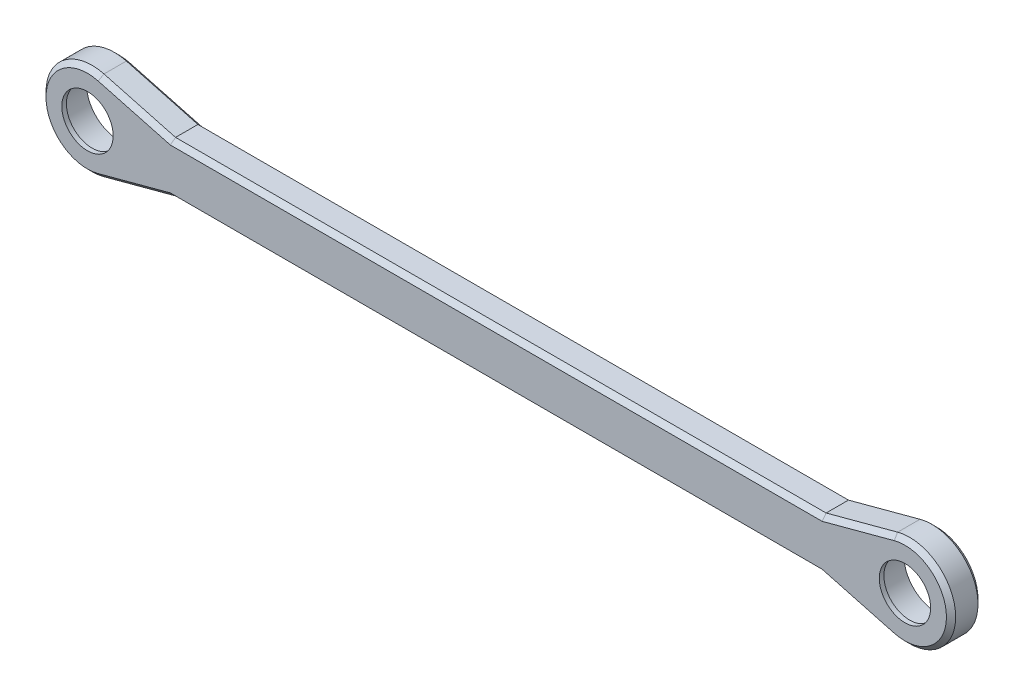
ISO-10303-21;
HEADER;
FILE_DESCRIPTION(('STEP AP214'),'2;1');
FILE_NAME('part.step','',(''),(''),'','','');
FILE_SCHEMA(('AUTOMOTIVE_DESIGN { 1 0 10303 214 1 1 1 1 }'));
ENDSEC;
DATA;
#1=APPLICATION_CONTEXT('core data for automotive mechanical design processes');
#2=APPLICATION_PROTOCOL_DEFINITION('international standard','automotive_design',2000,#1);
#3=PRODUCT_CONTEXT('',#1,'mechanical');
#4=PRODUCT('Part','Part','',(#3));
#5=PRODUCT_RELATED_PRODUCT_CATEGORY('part','',(#4));
#6=PRODUCT_DEFINITION_FORMATION('','',#4);
#7=PRODUCT_DEFINITION_CONTEXT('part definition',#1,'design');
#8=PRODUCT_DEFINITION('design','',#6,#7);
#9=PRODUCT_DEFINITION_SHAPE('','',#8);
#10=(LENGTH_UNIT() NAMED_UNIT(*) SI_UNIT(.MILLI.,.METRE.));
#11=(NAMED_UNIT(*) PLANE_ANGLE_UNIT() SI_UNIT($,.RADIAN.));
#12=(NAMED_UNIT(*) SI_UNIT($,.STERADIAN.) SOLID_ANGLE_UNIT());
#13=UNCERTAINTY_MEASURE_WITH_UNIT(LENGTH_MEASURE(1.E-05),#10,'distance_accuracy_value','');
#14=(GEOMETRIC_REPRESENTATION_CONTEXT(3) GLOBAL_UNCERTAINTY_ASSIGNED_CONTEXT((#13)) GLOBAL_UNIT_ASSIGNED_CONTEXT((#10,
#11,#12)) REPRESENTATION_CONTEXT('',''));
#15=CARTESIAN_POINT('',(0.,0.,0.));
#16=DIRECTION('',(0.,0.,1.));
#17=DIRECTION('',(1.,0.,0.));
#18=AXIS2_PLACEMENT_3D('',#15,#16,#17);
#19=CARTESIAN_POINT('',(177.4,0.,6.85));
#20=DIRECTION('',(0.,0.,-1.));
#21=DIRECTION('',(-1.,0.,0.));
#22=AXIS2_PLACEMENT_3D('',#19,#20,#21);
#23=CYLINDRICAL_SURFACE('',#22,7.075);
#24=CARTESIAN_POINT('',(177.4,0.,0.));
#25=DIRECTION('',(0.,0.,1.));
#26=DIRECTION('',(1.,0.,0.));
#27=AXIS2_PLACEMENT_3D('',#24,#25,#26);
#28=CIRCLE('',#27,7.075);
#29=CARTESIAN_POINT('',(170.325,0.,0.));
#30=VERTEX_POINT('',#29);
#31=EDGE_CURVE('E371',#30,#30,#28,.T.);
#32=CARTESIAN_POINT('',(177.4,0.,5.85));
#33=DIRECTION('',(0.,0.,1.));
#34=DIRECTION('',(1.,0.,0.));
#35=AXIS2_PLACEMENT_3D('',#32,#33,#34);
#36=CIRCLE('',#35,7.075);
#37=CARTESIAN_POINT('',(170.325,0.,5.85));
#38=VERTEX_POINT('',#37);
#39=EDGE_CURVE('E217',#38,#38,#36,.T.);
#40=CARTESIAN_POINT('',(170.325,0.,0.));
#41=CARTESIAN_POINT('',(170.325,0.,0.0609374999999999));
#42=CARTESIAN_POINT('',(170.325,0.,0.121875));
#43=CARTESIAN_POINT('',(170.325,0.,0.24375));
#44=CARTESIAN_POINT('',(170.325,0.,0.3046875));
#45=CARTESIAN_POINT('',(170.325,0.,0.4265625));
#46=CARTESIAN_POINT('',(170.325,0.,0.4875));
#47=CARTESIAN_POINT('',(170.325,0.,0.609375));
#48=CARTESIAN_POINT('',(170.325,0.,0.6703125));
#49=CARTESIAN_POINT('',(170.325,0.,0.7921875));
#50=CARTESIAN_POINT('',(170.325,0.,0.853125));
#51=CARTESIAN_POINT('',(170.325,0.,0.975));
#52=CARTESIAN_POINT('',(170.325,0.,1.0359375));
#53=CARTESIAN_POINT('',(170.325,0.,1.1578125));
#54=CARTESIAN_POINT('',(170.325,0.,1.21875));
#55=CARTESIAN_POINT('',(170.325,0.,1.340625));
#56=CARTESIAN_POINT('',(170.325,0.,1.4015625));
#57=CARTESIAN_POINT('',(170.325,0.,1.5234375));
#58=CARTESIAN_POINT('',(170.325,0.,1.584375));
#59=CARTESIAN_POINT('',(170.325,0.,1.70625));
#60=CARTESIAN_POINT('',(170.325,0.,1.7671875));
#61=CARTESIAN_POINT('',(170.325,0.,1.8890625));
#62=CARTESIAN_POINT('',(170.325,0.,1.95));
#63=CARTESIAN_POINT('',(170.325,0.,2.071875));
#64=CARTESIAN_POINT('',(170.325,0.,2.1328125));
#65=CARTESIAN_POINT('',(170.325,0.,2.2546875));
#66=CARTESIAN_POINT('',(170.325,0.,2.315625));
#67=CARTESIAN_POINT('',(170.325,0.,2.4375));
#68=CARTESIAN_POINT('',(170.325,0.,2.4984375));
#69=CARTESIAN_POINT('',(170.325,0.,2.6203125));
#70=CARTESIAN_POINT('',(170.325,0.,2.68125));
#71=CARTESIAN_POINT('',(170.325,0.,2.803125));
#72=CARTESIAN_POINT('',(170.325,0.,2.8640625));
#73=CARTESIAN_POINT('',(170.325,0.,2.9859375));
#74=CARTESIAN_POINT('',(170.325,0.,3.046875));
#75=CARTESIAN_POINT('',(170.325,0.,3.16875));
#76=CARTESIAN_POINT('',(170.325,0.,3.2296875));
#77=CARTESIAN_POINT('',(170.325,0.,3.3515625));
#78=CARTESIAN_POINT('',(170.325,0.,3.4125));
#79=CARTESIAN_POINT('',(170.325,0.,3.534375));
#80=CARTESIAN_POINT('',(170.325,0.,3.5953125));
#81=CARTESIAN_POINT('',(170.325,0.,3.7171875));
#82=CARTESIAN_POINT('',(170.325,0.,3.778125));
#83=CARTESIAN_POINT('',(170.325,0.,3.9));
#84=CARTESIAN_POINT('',(170.325,0.,3.9609375));
#85=CARTESIAN_POINT('',(170.325,0.,4.0828125));
#86=CARTESIAN_POINT('',(170.325,0.,4.14375));
#87=CARTESIAN_POINT('',(170.325,0.,4.265625));
#88=CARTESIAN_POINT('',(170.325,0.,4.3265625));
#89=CARTESIAN_POINT('',(170.325,0.,4.4484375));
#90=CARTESIAN_POINT('',(170.325,0.,4.509375));
#91=CARTESIAN_POINT('',(170.325,0.,4.63125));
#92=CARTESIAN_POINT('',(170.325,0.,4.6921875));
#93=CARTESIAN_POINT('',(170.325,0.,4.8140625));
#94=CARTESIAN_POINT('',(170.325,0.,4.875));
#95=CARTESIAN_POINT('',(170.325,0.,4.996875));
#96=CARTESIAN_POINT('',(170.325,0.,5.0578125));
#97=CARTESIAN_POINT('',(170.325,0.,5.1796875));
#98=CARTESIAN_POINT('',(170.325,0.,5.240625));
#99=CARTESIAN_POINT('',(170.325,0.,5.3625));
#100=CARTESIAN_POINT('',(170.325,0.,5.4234375));
#101=CARTESIAN_POINT('',(170.325,0.,5.5453125));
#102=CARTESIAN_POINT('',(170.325,0.,5.60625));
#103=CARTESIAN_POINT('',(170.325,0.,5.728125));
#104=CARTESIAN_POINT('',(170.325,0.,5.7890625));
#105=CARTESIAN_POINT('',(170.325,0.,5.85));
#106=B_SPLINE_CURVE_WITH_KNOTS('',3,(#40,#41,#42,#43,#44,#45,#46,#47,#48,#49,#50,#51,#52,#53,
#54,#55,#56,#57,#58,#59,#60,#61,#62,#63,#64,#65,#66,#67,#68,#69,#70,#71,#72,#73,#74,#75,#76,#77,
#78,#79,#80,#81,#82,#83,#84,#85,#86,#87,#88,#89,#90,#91,#92,#93,#94,#95,#96,#97,#98,#99,#100,
#101,#102,#103,#104,#105),.UNSPECIFIED.,.F.,.F.,(4,2,2,2,2,2,2,2,2,2,2,2,2,2,2,2,2,2,2,2,2,2,2,
2,2,2,2,2,2,2,2,2,4),(0.,0.1828125,0.365625,0.5484375,0.73125,0.9140625,1.096875,1.2796875,
1.4625,1.6453125,1.828125,2.0109375,2.19375,2.3765625,2.559375,2.7421875,2.925,3.1078125,
3.290625,3.4734375,3.65625,3.8390625,4.021875,4.2046875,4.3875,4.5703125,4.753125,4.9359375,
5.11875,5.3015625,5.484375,5.6671875,5.85),.UNSPECIFIED.);
#107=EDGE_CURVE('BSEAM48',#30,#38,#106,.T.);
#108=ORIENTED_EDGE('',*,*,#31,.F.);
#109=ORIENTED_EDGE('',*,*,#39,.T.);
#110=ORIENTED_EDGE('',*,*,#107,.T.);
#111=ORIENTED_EDGE('',*,*,#107,.F.);
#112=EDGE_LOOP('',(#108,#110,#109,#111));
#113=FACE_BOUND('',#112,.T.);
#114=ADVANCED_FACE('F48',(#113),#23,.F.);
#115=CARTESIAN_POINT('',(0.,0.,6.85));
#116=DIRECTION('',(0.,0.,-1.));
#117=DIRECTION('',(-1.,0.,0.));
#118=AXIS2_PLACEMENT_3D('',#115,#116,#117);
#119=CYLINDRICAL_SURFACE('',#118,7.075);
#120=CARTESIAN_POINT('',(0.,0.,0.));
#121=DIRECTION('',(0.,0.,1.));
#122=DIRECTION('',(1.,0.,0.));
#123=AXIS2_PLACEMENT_3D('',#120,#121,#122);
#124=CIRCLE('',#123,7.075);
#125=CARTESIAN_POINT('',(-7.075,0.,0.));
#126=VERTEX_POINT('',#125);
#127=EDGE_CURVE('E375',#126,#126,#124,.T.);
#128=CARTESIAN_POINT('',(0.,0.,5.85));
#129=DIRECTION('',(0.,0.,1.));
#130=DIRECTION('',(1.,0.,0.));
#131=AXIS2_PLACEMENT_3D('',#128,#129,#130);
#132=CIRCLE('',#131,7.075);
#133=CARTESIAN_POINT('',(-7.075,0.,5.85));
#134=VERTEX_POINT('',#133);
#135=EDGE_CURVE('E379',#134,#134,#132,.T.);
#136=CARTESIAN_POINT('',(-7.075,0.,0.));
#137=CARTESIAN_POINT('',(-7.075,0.,0.0609374999999999));
#138=CARTESIAN_POINT('',(-7.075,0.,0.121875));
#139=CARTESIAN_POINT('',(-7.075,0.,0.24375));
#140=CARTESIAN_POINT('',(-7.075,0.,0.3046875));
#141=CARTESIAN_POINT('',(-7.075,0.,0.4265625));
#142=CARTESIAN_POINT('',(-7.075,0.,0.4875));
#143=CARTESIAN_POINT('',(-7.075,0.,0.609375));
#144=CARTESIAN_POINT('',(-7.075,0.,0.6703125));
#145=CARTESIAN_POINT('',(-7.075,0.,0.7921875));
#146=CARTESIAN_POINT('',(-7.075,0.,0.853125));
#147=CARTESIAN_POINT('',(-7.075,0.,0.975));
#148=CARTESIAN_POINT('',(-7.075,0.,1.0359375));
#149=CARTESIAN_POINT('',(-7.075,0.,1.1578125));
#150=CARTESIAN_POINT('',(-7.075,0.,1.21875));
#151=CARTESIAN_POINT('',(-7.075,0.,1.340625));
#152=CARTESIAN_POINT('',(-7.075,0.,1.4015625));
#153=CARTESIAN_POINT('',(-7.075,0.,1.5234375));
#154=CARTESIAN_POINT('',(-7.075,0.,1.584375));
#155=CARTESIAN_POINT('',(-7.075,0.,1.70625));
#156=CARTESIAN_POINT('',(-7.075,0.,1.7671875));
#157=CARTESIAN_POINT('',(-7.075,0.,1.8890625));
#158=CARTESIAN_POINT('',(-7.075,0.,1.95));
#159=CARTESIAN_POINT('',(-7.075,0.,2.071875));
#160=CARTESIAN_POINT('',(-7.075,0.,2.1328125));
#161=CARTESIAN_POINT('',(-7.075,0.,2.2546875));
#162=CARTESIAN_POINT('',(-7.075,0.,2.315625));
#163=CARTESIAN_POINT('',(-7.075,0.,2.4375));
#164=CARTESIAN_POINT('',(-7.075,0.,2.4984375));
#165=CARTESIAN_POINT('',(-7.075,0.,2.6203125));
#166=CARTESIAN_POINT('',(-7.075,0.,2.68125));
#167=CARTESIAN_POINT('',(-7.075,0.,2.803125));
#168=CARTESIAN_POINT('',(-7.075,0.,2.8640625));
#169=CARTESIAN_POINT('',(-7.075,0.,2.9859375));
#170=CARTESIAN_POINT('',(-7.075,0.,3.046875));
#171=CARTESIAN_POINT('',(-7.075,0.,3.16875));
#172=CARTESIAN_POINT('',(-7.075,0.,3.2296875));
#173=CARTESIAN_POINT('',(-7.075,0.,3.3515625));
#174=CARTESIAN_POINT('',(-7.075,0.,3.4125));
#175=CARTESIAN_POINT('',(-7.075,0.,3.534375));
#176=CARTESIAN_POINT('',(-7.075,0.,3.5953125));
#177=CARTESIAN_POINT('',(-7.075,0.,3.7171875));
#178=CARTESIAN_POINT('',(-7.075,0.,3.778125));
#179=CARTESIAN_POINT('',(-7.075,0.,3.9));
#180=CARTESIAN_POINT('',(-7.075,0.,3.9609375));
#181=CARTESIAN_POINT('',(-7.075,0.,4.0828125));
#182=CARTESIAN_POINT('',(-7.075,0.,4.14375));
#183=CARTESIAN_POINT('',(-7.075,0.,4.265625));
#184=CARTESIAN_POINT('',(-7.075,0.,4.3265625));
#185=CARTESIAN_POINT('',(-7.075,0.,4.4484375));
#186=CARTESIAN_POINT('',(-7.075,0.,4.509375));
#187=CARTESIAN_POINT('',(-7.075,0.,4.63125));
#188=CARTESIAN_POINT('',(-7.075,0.,4.6921875));
#189=CARTESIAN_POINT('',(-7.075,0.,4.8140625));
#190=CARTESIAN_POINT('',(-7.075,0.,4.875));
#191=CARTESIAN_POINT('',(-7.075,0.,4.996875));
#192=CARTESIAN_POINT('',(-7.075,0.,5.0578125));
#193=CARTESIAN_POINT('',(-7.075,0.,5.1796875));
#194=CARTESIAN_POINT('',(-7.075,0.,5.240625));
#195=CARTESIAN_POINT('',(-7.075,0.,5.3625));
#196=CARTESIAN_POINT('',(-7.075,0.,5.4234375));
#197=CARTESIAN_POINT('',(-7.075,0.,5.5453125));
#198=CARTESIAN_POINT('',(-7.075,0.,5.60625));
#199=CARTESIAN_POINT('',(-7.075,0.,5.728125));
#200=CARTESIAN_POINT('',(-7.075,0.,5.7890625));
#201=CARTESIAN_POINT('',(-7.075,0.,5.85));
#202=B_SPLINE_CURVE_WITH_KNOTS('',3,(#136,#137,#138,#139,#140,#141,#142,#143,#144,#145,#146,
#147,#148,#149,#150,#151,#152,#153,#154,#155,#156,#157,#158,#159,#160,#161,#162,#163,#164,#165,
#166,#167,#168,#169,#170,#171,#172,#173,#174,#175,#176,#177,#178,#179,#180,#181,#182,#183,#184,
#185,#186,#187,#188,#189,#190,#191,#192,#193,#194,#195,#196,#197,#198,#199,#200,#201),
.UNSPECIFIED.,.F.,.F.,(4,2,2,2,2,2,2,2,2,2,2,2,2,2,2,2,2,2,2,2,2,2,2,2,2,2,2,2,2,2,2,2,4),(0.,
0.1828125,0.365625,0.5484375,0.73125,0.9140625,1.096875,1.2796875,1.4625,1.6453125,1.828125,
2.0109375,2.19375,2.3765625,2.559375,2.7421875,2.925,3.1078125,3.290625,3.4734375,3.65625,
3.8390625,4.021875,4.2046875,4.3875,4.5703125,4.753125,4.9359375,5.11875,5.3015625,5.484375,
5.6671875,5.85),.UNSPECIFIED.);
#203=EDGE_CURVE('BSEAM421',#126,#134,#202,.T.);
#204=ORIENTED_EDGE('',*,*,#127,.F.);
#205=ORIENTED_EDGE('',*,*,#135,.T.);
#206=ORIENTED_EDGE('',*,*,#203,.T.);
#207=ORIENTED_EDGE('',*,*,#203,.F.);
#208=EDGE_LOOP('',(#204,#206,#205,#207));
#209=FACE_BOUND('',#208,.T.);
#210=ADVANCED_FACE('F421',(#209),#119,.F.);
#211=CARTESIAN_POINT('',(9.29535623329457,34.6907417371083,6.85));
#212=DIRECTION('',(-0.258819045102515,-0.96592582628907,0.));
#213=DIRECTION('',(0.96592582628907,-0.258819045102515,0.));
#214=AXIS2_PLACEMENT_3D('',#211,#212,#213);
#215=PLANE('',#214);
#216=DIRECTION('',(0.,0.,-1.));
#217=VECTOR('',#216,1.);
#218=CARTESIAN_POINT('',(159.289246390066,-5.5,6.85));
#219=LINE('',#218,#217);
#220=CARTESIAN_POINT('',(159.289246390066,-5.5,5.84999999999997));
#221=VERTEX_POINT('',#220);
#222=CARTESIAN_POINT('',(159.289246390066,-5.5,0.999999999999975));
#223=VERTEX_POINT('',#222);
#224=EDGE_CURVE('E367',#221,#223,#219,.T.);
#225=ORIENTED_EDGE('',*,*,#224,.T.);
#226=DIRECTION('',(0.96592582628907,-0.258819045102515,0.));
#227=VECTOR('',#226,1.);
#228=CARTESIAN_POINT('',(174.811809548975,-9.6592582628907,1.00000000000007));
#229=LINE('',#228,#227);
#230=CARTESIAN_POINT('',(174.811809548975,-9.65925826289071,1.00000000000008));
#231=VERTEX_POINT('',#230);
#232=EDGE_CURVE('E317',#223,#231,#229,.T.);
#233=ORIENTED_EDGE('',*,*,#232,.T.);
#234=DIRECTION('',(0.,0.,-1.));
#235=VECTOR('',#234,1.);
#236=CARTESIAN_POINT('',(174.811809548975,-9.65925826289071,6.85));
#237=LINE('',#236,#235);
#238=CARTESIAN_POINT('',(174.811809548975,-9.65925826289071,5.84999999999997));
#239=VERTEX_POINT('',#238);
#240=EDGE_CURVE('E187',#239,#231,#237,.T.);
#241=ORIENTED_EDGE('',*,*,#240,.F.);
#242=DIRECTION('',(-0.96592582628907,0.258819045102515,0.));
#243=VECTOR('',#242,1.);
#244=CARTESIAN_POINT('',(9.29535623329457,34.6907417371083,5.84999999999997));
#245=LINE('',#244,#243);
#246=EDGE_CURVE('E321',#239,#221,#245,.T.);
#247=ORIENTED_EDGE('',*,*,#246,.T.);
#248=EDGE_LOOP('',(#225,#233,#241,#247));
#249=FACE_BOUND('',#248,.T.);
#250=ADVANCED_FACE('F427',(#249),#215,.T.);
#251=CARTESIAN_POINT('',(177.4,0.,6.85));
#252=DIRECTION('',(0.,0.,-1.));
#253=DIRECTION('',(-1.,0.,0.));
#254=AXIS2_PLACEMENT_3D('',#251,#252,#253);
#255=CYLINDRICAL_SURFACE('',#254,10.);
#256=ORIENTED_EDGE('',*,*,#240,.T.);
#257=CARTESIAN_POINT('',(177.4,0.,1.00000000000008));
#258=DIRECTION('',(0.,0.,1.));
#259=DIRECTION('',(1.,0.,0.));
#260=AXIS2_PLACEMENT_3D('',#257,#258,#259);
#261=CIRCLE('',#260,10.);
#262=CARTESIAN_POINT('',(174.811809548975,9.65925826289071,1.00000000000008));
#263=VERTEX_POINT('',#262);
#264=EDGE_CURVE('E305',#231,#263,#261,.T.);
#265=ORIENTED_EDGE('',*,*,#264,.T.);
#266=DIRECTION('',(0.,0.,-1.));
#267=VECTOR('',#266,1.);
#268=CARTESIAN_POINT('',(174.811809548975,9.65925826289071,6.85));
#269=LINE('',#268,#267);
#270=CARTESIAN_POINT('',(174.811809548975,9.65925826289071,5.84999999999997));
#271=VERTEX_POINT('',#270);
#272=EDGE_CURVE('E343',#271,#263,#269,.T.);
#273=ORIENTED_EDGE('',*,*,#272,.F.);
#274=CARTESIAN_POINT('',(177.4,0.,5.84999999999997));
#275=DIRECTION('',(0.,0.,1.));
#276=DIRECTION('',(1.,0.,0.));
#277=AXIS2_PLACEMENT_3D('',#274,#275,#276);
#278=CIRCLE('',#277,10.);
#279=EDGE_CURVE('E308',#271,#239,#278,.F.);
#280=ORIENTED_EDGE('',*,*,#279,.T.);
#281=EDGE_LOOP('',(#256,#265,#273,#280));
#282=FACE_BOUND('',#281,.T.);
#283=ADVANCED_FACE('F458',(#282),#255,.T.);
#284=CARTESIAN_POINT('',(9.29535623329461,-34.6907417371084,6.85));
#285=DIRECTION('',(0.258819045102515,-0.96592582628907,0.));
#286=DIRECTION('',(0.96592582628907,0.258819045102515,0.));
#287=AXIS2_PLACEMENT_3D('',#284,#285,#286);
#288=PLANE('',#287);
#289=ORIENTED_EDGE('',*,*,#272,.T.);
#290=DIRECTION('',(-0.96592582628907,-0.258819045102515,0.));
#291=VECTOR('',#290,1.);
#292=CARTESIAN_POINT('',(9.29535623329461,-34.6907417371084,1.00000000000008));
#293=LINE('',#292,#291);
#294=CARTESIAN_POINT('',(159.289246390066,5.5,1.00000000000003));
#295=VERTEX_POINT('',#294);
#296=EDGE_CURVE('E311',#263,#295,#293,.T.);
#297=ORIENTED_EDGE('',*,*,#296,.T.);
#298=DIRECTION('',(0.,0.,-1.));
#299=VECTOR('',#298,1.);
#300=CARTESIAN_POINT('',(159.289246390066,5.5,6.85));
#301=LINE('',#300,#299);
#302=CARTESIAN_POINT('',(159.289246390066,5.5,5.84999999999998));
#303=VERTEX_POINT('',#302);
#304=EDGE_CURVE('E347',#303,#295,#301,.T.);
#305=ORIENTED_EDGE('',*,*,#304,.F.);
#306=DIRECTION('',(0.96592582628907,0.258819045102515,0.));
#307=VECTOR('',#306,1.);
#308=CARTESIAN_POINT('',(174.811809548975,9.65925826289068,5.84999999999998));
#309=LINE('',#308,#307);
#310=EDGE_CURVE('E314',#303,#271,#309,.T.);
#311=ORIENTED_EDGE('',*,*,#310,.T.);
#312=EDGE_LOOP('',(#289,#297,#305,#311));
#313=FACE_BOUND('',#312,.T.);
#314=ADVANCED_FACE('F454',(#313),#288,.F.);
#315=CARTESIAN_POINT('',(0.,5.5,6.85));
#316=DIRECTION('',(0.,1.,0.));
#317=DIRECTION('',(0.,0.,1.));
#318=AXIS2_PLACEMENT_3D('',#315,#316,#317);
#319=PLANE('',#318);
#320=ORIENTED_EDGE('',*,*,#304,.T.);
#321=DIRECTION('',(-1.,0.,0.));
#322=VECTOR('',#321,1.);
#323=CARTESIAN_POINT('',(18.1107536099339,5.5,1.00000000000003));
#324=LINE('',#323,#322);
#325=CARTESIAN_POINT('',(18.1107536099339,5.5,0.999999999999975));
#326=VERTEX_POINT('',#325);
#327=EDGE_CURVE('E299',#295,#326,#324,.T.);
#328=ORIENTED_EDGE('',*,*,#327,.T.);
#329=DIRECTION('',(0.,0.,-1.));
#330=VECTOR('',#329,1.);
#331=CARTESIAN_POINT('',(18.1107536099339,5.5,6.85));
#332=LINE('',#331,#330);
#333=CARTESIAN_POINT('',(18.1107536099339,5.5,5.85));
#334=VERTEX_POINT('',#333);
#335=EDGE_CURVE('E351',#334,#326,#332,.T.);
#336=ORIENTED_EDGE('',*,*,#335,.F.);
#337=DIRECTION('',(1.,0.,0.));
#338=VECTOR('',#337,1.);
#339=CARTESIAN_POINT('',(0.,5.5,5.85));
#340=LINE('',#339,#338);
#341=EDGE_CURVE('E302',#334,#303,#340,.T.);
#342=ORIENTED_EDGE('',*,*,#341,.T.);
#343=EDGE_LOOP('',(#320,#328,#336,#342));
#344=FACE_BOUND('',#343,.T.);
#345=ADVANCED_FACE('F450',(#344),#319,.T.);
#346=CARTESIAN_POINT('',(2.58819045102521,9.65925826289068,6.85));
#347=DIRECTION('',(0.258819045102521,0.965925826289068,0.));
#348=DIRECTION('',(-0.965925826289068,0.258819045102521,0.));
#349=AXIS2_PLACEMENT_3D('',#346,#347,#348);
#350=PLANE('',#349);
#351=ORIENTED_EDGE('',*,*,#335,.T.);
#352=DIRECTION('',(-0.965925826289068,0.258819045102521,0.));
#353=VECTOR('',#352,1.);
#354=CARTESIAN_POINT('',(2.58819045102521,9.65925826289068,0.999999999999973));
#355=LINE('',#354,#353);
#356=CARTESIAN_POINT('',(2.58819045102521,9.65925826289068,0.999999999999975));
#357=VERTEX_POINT('',#356);
#358=EDGE_CURVE('E293',#326,#357,#355,.T.);
#359=ORIENTED_EDGE('',*,*,#358,.T.);
#360=DIRECTION('',(0.,0.,-1.));
#361=VECTOR('',#360,1.);
#362=CARTESIAN_POINT('',(2.58819045102521,9.65925826289068,6.85));
#363=LINE('',#362,#361);
#364=CARTESIAN_POINT('',(2.58819045102521,9.65925826289068,5.85));
#365=VERTEX_POINT('',#364);
#366=EDGE_CURVE('E355',#365,#357,#363,.T.);
#367=ORIENTED_EDGE('',*,*,#366,.F.);
#368=DIRECTION('',(0.965925826289068,-0.258819045102521,0.));
#369=VECTOR('',#368,1.);
#370=CARTESIAN_POINT('',(2.58819045102521,9.65925826289068,5.85));
#371=LINE('',#370,#369);
#372=EDGE_CURVE('E296',#365,#334,#371,.T.);
#373=ORIENTED_EDGE('',*,*,#372,.T.);
#374=EDGE_LOOP('',(#351,#359,#367,#373));
#375=FACE_BOUND('',#374,.T.);
#376=ADVANCED_FACE('F446',(#375),#350,.T.);
#377=CARTESIAN_POINT('',(0.,0.,6.85));
#378=DIRECTION('',(0.,0.,-1.));
#379=DIRECTION('',(-1.,0.,0.));
#380=AXIS2_PLACEMENT_3D('',#377,#378,#379);
#381=CYLINDRICAL_SURFACE('',#380,9.99999999999999);
#382=ORIENTED_EDGE('',*,*,#366,.T.);
#383=CARTESIAN_POINT('',(0.,0.,0.999999999999973));
#384=DIRECTION('',(0.,0.,1.));
#385=DIRECTION('',(1.,0.,0.));
#386=AXIS2_PLACEMENT_3D('',#383,#384,#385);
#387=CIRCLE('',#386,9.99999999999999);
#388=CARTESIAN_POINT('',(2.58819045102522,-9.65925826289068,0.999999999999975));
#389=VERTEX_POINT('',#388);
#390=EDGE_CURVE('E287',#357,#389,#387,.T.);
#391=ORIENTED_EDGE('',*,*,#390,.T.);
#392=DIRECTION('',(0.,0.,-1.));
#393=VECTOR('',#392,1.);
#394=CARTESIAN_POINT('',(2.58819045102522,-9.65925826289068,6.85));
#395=LINE('',#394,#393);
#396=CARTESIAN_POINT('',(2.58819045102522,-9.65925826289068,5.85));
#397=VERTEX_POINT('',#396);
#398=EDGE_CURVE('E359',#397,#389,#395,.T.);
#399=ORIENTED_EDGE('',*,*,#398,.F.);
#400=CARTESIAN_POINT('',(0.,0.,5.85));
#401=DIRECTION('',(0.,0.,1.));
#402=DIRECTION('',(1.,0.,0.));
#403=AXIS2_PLACEMENT_3D('',#400,#401,#402);
#404=CIRCLE('',#403,9.99999999999999);
#405=EDGE_CURVE('E290',#397,#365,#404,.F.);
#406=ORIENTED_EDGE('',*,*,#405,.T.);
#407=EDGE_LOOP('',(#382,#391,#399,#406));
#408=FACE_BOUND('',#407,.T.);
#409=ADVANCED_FACE('F442',(#408),#381,.T.);
#410=CARTESIAN_POINT('',(2.58819045102522,-9.65925826289068,6.85));
#411=DIRECTION('',(-0.258819045102522,0.965925826289068,0.));
#412=DIRECTION('',(-0.965925826289068,-0.258819045102522,0.));
#413=AXIS2_PLACEMENT_3D('',#410,#411,#412);
#414=PLANE('',#413);
#415=ORIENTED_EDGE('',*,*,#398,.T.);
#416=DIRECTION('',(0.965925826289068,0.258819045102522,0.));
#417=VECTOR('',#416,1.);
#418=CARTESIAN_POINT('',(2.58819045102522,-9.65925826289068,0.999999999999973));
#419=LINE('',#418,#417);
#420=CARTESIAN_POINT('',(18.1107536099339,-5.5,0.999999999999975));
#421=VERTEX_POINT('',#420);
#422=EDGE_CURVE('E275',#389,#421,#419,.T.);
#423=ORIENTED_EDGE('',*,*,#422,.T.);
#424=DIRECTION('',(0.,0.,-1.));
#425=VECTOR('',#424,1.);
#426=CARTESIAN_POINT('',(18.1107536099339,-5.5,6.85));
#427=LINE('',#426,#425);
#428=CARTESIAN_POINT('',(18.1107536099339,-5.5,5.84999999999997));
#429=VERTEX_POINT('',#428);
#430=EDGE_CURVE('E363',#429,#421,#427,.T.);
#431=ORIENTED_EDGE('',*,*,#430,.F.);
#432=DIRECTION('',(-0.965925826289068,-0.258819045102522,0.));
#433=VECTOR('',#432,1.);
#434=CARTESIAN_POINT('',(2.58819045102522,-9.65925826289068,5.85));
#435=LINE('',#434,#433);
#436=EDGE_CURVE('E278',#429,#397,#435,.T.);
#437=ORIENTED_EDGE('',*,*,#436,.T.);
#438=EDGE_LOOP('',(#415,#423,#431,#437));
#439=FACE_BOUND('',#438,.T.);
#440=ADVANCED_FACE('F438',(#439),#414,.F.);
#441=CARTESIAN_POINT('',(0.,-5.5,6.85));
#442=DIRECTION('',(0.,1.,0.));
#443=DIRECTION('',(-1.,0.,0.));
#444=AXIS2_PLACEMENT_3D('',#441,#442,#443);
#445=PLANE('',#444);
#446=ORIENTED_EDGE('',*,*,#430,.T.);
#447=DIRECTION('',(1.,0.,0.));
#448=VECTOR('',#447,1.);
#449=CARTESIAN_POINT('',(0.,-5.5,0.999999999999973));
#450=LINE('',#449,#448);
#451=EDGE_CURVE('E190',#421,#223,#450,.T.);
#452=ORIENTED_EDGE('',*,*,#451,.T.);
#453=ORIENTED_EDGE('',*,*,#224,.F.);
#454=DIRECTION('',(-1.,0.,0.));
#455=VECTOR('',#454,1.);
#456=CARTESIAN_POINT('',(18.1107536099339,-5.5,5.84999999999997));
#457=LINE('',#456,#455);
#458=EDGE_CURVE('E284',#221,#429,#457,.T.);
#459=ORIENTED_EDGE('',*,*,#458,.T.);
#460=EDGE_LOOP('',(#446,#452,#453,#459));
#461=FACE_BOUND('',#460,.T.);
#462=ADVANCED_FACE('F434',(#461),#445,.F.);
#463=CARTESIAN_POINT('',(0.,0.,6.85));
#464=DIRECTION('',(0.,0.,1.));
#465=DIRECTION('',(1.,0.,0.));
#466=AXIS2_PLACEMENT_3D('',#463,#464,#465);
#467=PLANE('',#466);
#468=CARTESIAN_POINT('',(0.,0.,6.85));
#469=DIRECTION('',(0.,0.,1.));
#470=DIRECTION('',(1.,0.,0.));
#471=AXIS2_PLACEMENT_3D('',#468,#469,#470);
#472=CIRCLE('',#471,8.99999999999997);
#473=CARTESIAN_POINT('',(2.32937140592268,8.69333243660158,6.85));
#474=VERTEX_POINT('',#473);
#475=CARTESIAN_POINT('',(2.32937140592269,-8.69333243660158,6.85));
#476=VERTEX_POINT('',#475);
#477=EDGE_CURVE('E59',#474,#476,#472,.T.);
#478=ORIENTED_EDGE('',*,*,#477,.T.);
#479=DIRECTION('',(0.965925826289068,0.258819045102522,0.));
#480=VECTOR('',#479,1.);
#481=CARTESIAN_POINT('',(17.8519345648313,-4.5340741737109,6.85));
#482=LINE('',#481,#480);
#483=CARTESIAN_POINT('',(17.9791011123464,-4.5,6.85));
#484=VERTEX_POINT('',#483);
#485=EDGE_CURVE('E11',#476,#484,#482,.T.);
#486=ORIENTED_EDGE('',*,*,#485,.T.);
#487=DIRECTION('',(1.,0.,0.));
#488=VECTOR('',#487,1.);
#489=CARTESIAN_POINT('',(159.289246390066,-4.5,6.85));
#490=LINE('',#489,#488);
#491=CARTESIAN_POINT('',(159.420898887653,-4.5,6.85));
#492=VERTEX_POINT('',#491);
#493=EDGE_CURVE('E272',#484,#492,#490,.T.);
#494=ORIENTED_EDGE('',*,*,#493,.T.);
#495=DIRECTION('',(0.96592582628907,-0.258819045102515,0.));
#496=VECTOR('',#495,1.);
#497=CARTESIAN_POINT('',(9.55417527839709,35.6566675633974,6.85));
#498=LINE('',#497,#496);
#499=CARTESIAN_POINT('',(175.070628594077,-8.69333243660163,6.85));
#500=VERTEX_POINT('',#499);
#501=EDGE_CURVE('E269',#492,#500,#498,.T.);
#502=ORIENTED_EDGE('',*,*,#501,.T.);
#503=CARTESIAN_POINT('',(177.4,0.,6.85));
#504=DIRECTION('',(0.,0.,1.));
#505=DIRECTION('',(1.,0.,0.));
#506=AXIS2_PLACEMENT_3D('',#503,#504,#505);
#507=CIRCLE('',#506,9.00000000000001);
#508=CARTESIAN_POINT('',(175.070628594077,8.69333243660164,6.85));
#509=VERTEX_POINT('',#508);
#510=EDGE_CURVE('E266',#500,#509,#507,.T.);
#511=ORIENTED_EDGE('',*,*,#510,.T.);
#512=DIRECTION('',(-0.96592582628907,-0.258819045102515,0.));
#513=VECTOR('',#512,1.);
#514=CARTESIAN_POINT('',(159.548065435168,4.53407417371093,6.85));
#515=LINE('',#514,#513);
#516=CARTESIAN_POINT('',(159.420898887653,4.49999999999997,6.85));
#517=VERTEX_POINT('',#516);
#518=EDGE_CURVE('E263',#509,#517,#515,.T.);
#519=ORIENTED_EDGE('',*,*,#518,.T.);
#520=DIRECTION('',(-1.,0.,0.));
#521=VECTOR('',#520,1.);
#522=CARTESIAN_POINT('',(0.,4.49999999999997,6.85));
#523=LINE('',#522,#521);
#524=CARTESIAN_POINT('',(17.9791011123464,4.49999999999997,6.85));
#525=VERTEX_POINT('',#524);
#526=EDGE_CURVE('E260',#517,#525,#523,.T.);
#527=ORIENTED_EDGE('',*,*,#526,.T.);
#528=DIRECTION('',(-0.965925826289068,0.258819045102521,0.));
#529=VECTOR('',#528,1.);
#530=CARTESIAN_POINT('',(2.32937140592268,8.69333243660158,6.85));
#531=LINE('',#530,#529);
#532=EDGE_CURVE('E70',#525,#474,#531,.T.);
#533=ORIENTED_EDGE('',*,*,#532,.T.);
#534=EDGE_LOOP('',(#478,#486,#494,#502,#511,#519,#527,#533));
#535=FACE_BOUND('',#534,.T.);
#536=CARTESIAN_POINT('',(0.,0.,6.85));
#537=DIRECTION('',(0.,0.,1.));
#538=DIRECTION('',(1.,0.,0.));
#539=AXIS2_PLACEMENT_3D('',#536,#537,#538);
#540=CIRCLE('',#539,5.575);
#541=CARTESIAN_POINT('',(5.575,0.,6.85));
#542=VERTEX_POINT('',#541);
#543=EDGE_CURVE('E384',#542,#542,#540,.T.);
#544=ORIENTED_EDGE('',*,*,#543,.F.);
#545=EDGE_LOOP('',(#544));
#546=FACE_BOUND('',#545,.T.);
#547=CARTESIAN_POINT('',(177.4,0.,6.85));
#548=DIRECTION('',(0.,0.,1.));
#549=DIRECTION('',(1.,0.,0.));
#550=AXIS2_PLACEMENT_3D('',#547,#548,#549);
#551=CIRCLE('',#550,5.575);
#552=CARTESIAN_POINT('',(182.975,0.,6.85));
#553=VERTEX_POINT('',#552);
#554=EDGE_CURVE('E388',#553,#553,#551,.T.);
#555=ORIENTED_EDGE('',*,*,#554,.F.);
#556=EDGE_LOOP('',(#555));
#557=FACE_BOUND('',#556,.T.);
#558=ADVANCED_FACE('F437',(#535,#546,#557),#467,.T.);
#559=CARTESIAN_POINT('',(0.,0.,0.));
#560=DIRECTION('',(0.,0.,1.));
#561=DIRECTION('',(1.,0.,0.));
#562=AXIS2_PLACEMENT_3D('',#559,#560,#561);
#563=PLANE('',#562);
#564=DIRECTION('',(0.96592582628907,0.258819045102515,0.));
#565=VECTOR('',#564,1.);
#566=CARTESIAN_POINT('',(9.55417527839715,-35.6566675633975,0.));
#567=LINE('',#566,#565);
#568=CARTESIAN_POINT('',(159.420898887653,4.5,0.));
#569=VERTEX_POINT('',#568);
#570=CARTESIAN_POINT('',(175.070628594077,8.69333243660154,0.));
#571=VERTEX_POINT('',#570);
#572=EDGE_CURVE('E329',#569,#571,#567,.T.);
#573=ORIENTED_EDGE('',*,*,#572,.T.);
#574=CARTESIAN_POINT('',(177.4,0.,0.));
#575=DIRECTION('',(0.,0.,1.));
#576=DIRECTION('',(1.,0.,0.));
#577=AXIS2_PLACEMENT_3D('',#574,#575,#576);
#578=CIRCLE('',#577,8.9999999999999);
#579=CARTESIAN_POINT('',(175.070628594077,-8.69333243660153,0.));
#580=VERTEX_POINT('',#579);
#581=EDGE_CURVE('E324',#571,#580,#578,.F.);
#582=ORIENTED_EDGE('',*,*,#581,.T.);
#583=DIRECTION('',(-0.96592582628907,0.258819045102515,0.));
#584=VECTOR('',#583,1.);
#585=CARTESIAN_POINT('',(159.548065435168,-4.53407417371083,0.));
#586=LINE('',#585,#584);
#587=CARTESIAN_POINT('',(159.420898887654,-4.5,0.));
#588=VERTEX_POINT('',#587);
#589=EDGE_CURVE('E170',#580,#588,#586,.T.);
#590=ORIENTED_EDGE('',*,*,#589,.T.);
#591=DIRECTION('',(-1.,0.,0.));
#592=VECTOR('',#591,1.);
#593=CARTESIAN_POINT('',(0.,-4.5,0.));
#594=LINE('',#593,#592);
#595=CARTESIAN_POINT('',(17.9791011123465,-4.5,0.));
#596=VERTEX_POINT('',#595);
#597=EDGE_CURVE('E163',#588,#596,#594,.T.);
#598=ORIENTED_EDGE('',*,*,#597,.T.);
#599=DIRECTION('',(-0.965925826289068,-0.258819045102522,0.));
#600=VECTOR('',#599,1.);
#601=CARTESIAN_POINT('',(2.3293714059227,-8.69333243660162,0.));
#602=LINE('',#601,#600);
#603=CARTESIAN_POINT('',(2.3293714059227,-8.69333243660162,0.));
#604=VERTEX_POINT('',#603);
#605=EDGE_CURVE('E167',#596,#604,#602,.T.);
#606=ORIENTED_EDGE('',*,*,#605,.T.);
#607=CARTESIAN_POINT('',(0.,0.,0.));
#608=DIRECTION('',(0.,0.,1.));
#609=DIRECTION('',(1.,0.,0.));
#610=AXIS2_PLACEMENT_3D('',#607,#608,#609);
#611=CIRCLE('',#610,8.99999999999999);
#612=CARTESIAN_POINT('',(2.32937140592269,8.6933324366016,0.));
#613=VERTEX_POINT('',#612);
#614=EDGE_CURVE('E175',#604,#613,#611,.F.);
#615=ORIENTED_EDGE('',*,*,#614,.T.);
#616=DIRECTION('',(0.965925826289068,-0.258819045102521,0.));
#617=VECTOR('',#616,1.);
#618=CARTESIAN_POINT('',(17.8519345648313,4.53407417371093,0.));
#619=LINE('',#618,#617);
#620=CARTESIAN_POINT('',(17.9791011123464,4.5,0.));
#621=VERTEX_POINT('',#620);
#622=EDGE_CURVE('E335',#613,#621,#619,.T.);
#623=ORIENTED_EDGE('',*,*,#622,.T.);
#624=DIRECTION('',(1.,0.,0.));
#625=VECTOR('',#624,1.);
#626=CARTESIAN_POINT('',(159.289246390066,4.5,0.));
#627=LINE('',#626,#625);
#628=EDGE_CURVE('E332',#621,#569,#627,.T.);
#629=ORIENTED_EDGE('',*,*,#628,.T.);
#630=EDGE_LOOP('',(#573,#582,#590,#598,#606,#615,#623,#629));
#631=FACE_BOUND('',#630,.T.);
#632=ORIENTED_EDGE('',*,*,#127,.T.);
#633=EDGE_LOOP('',(#632));
#634=FACE_BOUND('',#633,.T.);
#635=ORIENTED_EDGE('',*,*,#31,.T.);
#636=EDGE_LOOP('',(#635));
#637=FACE_BOUND('',#636,.T.);
#638=ADVANCED_FACE('F165',(#631,#634,#637),#563,.F.);
#639=CARTESIAN_POINT('',(0.,0.,5.85));
#640=DIRECTION('',(0.,0.,1.));
#641=DIRECTION('',(1.,0.,0.));
#642=AXIS2_PLACEMENT_3D('',#639,#640,#641);
#643=PLANE('',#642);
#644=CARTESIAN_POINT('',(0.,0.,5.85));
#645=DIRECTION('',(0.,0.,1.));
#646=DIRECTION('',(1.,0.,0.));
#647=AXIS2_PLACEMENT_3D('',#644,#645,#646);
#648=CIRCLE('',#647,5.575);
#649=CARTESIAN_POINT('',(5.575,0.,5.85));
#650=VERTEX_POINT('',#649);
#651=EDGE_CURVE('E383',#650,#650,#648,.T.);
#652=ORIENTED_EDGE('',*,*,#651,.T.);
#653=EDGE_LOOP('',(#652));
#654=FACE_BOUND('',#653,.T.);
#655=ORIENTED_EDGE('',*,*,#135,.F.);
#656=EDGE_LOOP('',(#655));
#657=FACE_BOUND('',#656,.T.);
#658=ADVANCED_FACE('F417',(#654,#657),#643,.F.);
#659=CARTESIAN_POINT('',(0.,0.,5.85));
#660=DIRECTION('',(0.,0.,1.));
#661=DIRECTION('',(1.,0.,0.));
#662=AXIS2_PLACEMENT_3D('',#659,#660,#661);
#663=CYLINDRICAL_SURFACE('',#662,5.575);
#664=ORIENTED_EDGE('',*,*,#651,.F.);
#665=EDGE_LOOP('',(#664));
#666=FACE_BOUND('',#665,.T.);
#667=ORIENTED_EDGE('',*,*,#543,.T.);
#668=EDGE_LOOP('',(#667));
#669=FACE_BOUND('',#668,.T.);
#670=ADVANCED_FACE('F407',(#666,#669),#663,.F.);
#671=CARTESIAN_POINT('',(177.4,0.,5.85));
#672=DIRECTION('',(0.,0.,1.));
#673=DIRECTION('',(1.,0.,0.));
#674=AXIS2_PLACEMENT_3D('',#671,#672,#673);
#675=PLANE('',#674);
#676=CARTESIAN_POINT('',(177.4,0.,5.85));
#677=DIRECTION('',(0.,0.,1.));
#678=DIRECTION('',(1.,0.,0.));
#679=AXIS2_PLACEMENT_3D('',#676,#677,#678);
#680=CIRCLE('',#679,5.575);
#681=CARTESIAN_POINT('',(182.975,0.,5.85));
#682=VERTEX_POINT('',#681);
#683=EDGE_CURVE('E392',#682,#682,#680,.T.);
#684=ORIENTED_EDGE('',*,*,#683,.T.);
#685=EDGE_LOOP('',(#684));
#686=FACE_BOUND('',#685,.T.);
#687=ORIENTED_EDGE('',*,*,#39,.F.);
#688=EDGE_LOOP('',(#687));
#689=FACE_BOUND('',#688,.T.);
#690=ADVANCED_FACE('F404',(#686,#689),#675,.F.);
#691=CARTESIAN_POINT('',(177.4,0.,5.85));
#692=DIRECTION('',(0.,0.,1.));
#693=DIRECTION('',(1.,0.,0.));
#694=AXIS2_PLACEMENT_3D('',#691,#692,#693);
#695=CYLINDRICAL_SURFACE('',#694,5.575);
#696=ORIENTED_EDGE('',*,*,#683,.F.);
#697=EDGE_LOOP('',(#696));
#698=FACE_BOUND('',#697,.T.);
#699=ORIENTED_EDGE('',*,*,#554,.T.);
#700=EDGE_LOOP('',(#699));
#701=FACE_BOUND('',#700,.T.);
#702=ADVANCED_FACE('F406',(#698,#701),#695,.F.);
#703=CARTESIAN_POINT('',(2.32937140592269,8.69333243660161,0.));
#704=DIRECTION('',(0.183012701892217,0.683012701892209,-0.707106781186558));
#705=DIRECTION('',(-0.965925826289068,0.258819045102521,0.));
#706=AXIS2_PLACEMENT_3D('',#703,#704,#705);
#707=PLANE('',#706);
#708=DIRECTION('',(-0.183012701892222,-0.68301270189223,-0.707106781186537));
#709=VECTOR('',#708,1.);
#710=CARTESIAN_POINT('',(2.58819045102521,9.65925826289068,0.999999999999973));
#711=LINE('',#710,#709);
#712=EDGE_CURVE('E209',#357,#613,#711,.T.);
#713=ORIENTED_EDGE('',*,*,#712,.F.);
#714=ORIENTED_EDGE('',*,*,#358,.F.);
#715=DIRECTION('',(-0.0926915987237285,-0.704062592219616,-0.704062592219636));
#716=VECTOR('',#715,1.);
#717=CARTESIAN_POINT('',(17.8246294854669,3.32667150483219,-1.17332849516785));
#718=LINE('',#717,#716);
#719=EDGE_CURVE('E213',#621,#326,#718,.F.);
#720=ORIENTED_EDGE('',*,*,#719,.F.);
#721=ORIENTED_EDGE('',*,*,#622,.F.);
#722=EDGE_LOOP('',(#713,#714,#720,#721));
#723=FACE_BOUND('',#722,.T.);
#724=ADVANCED_FACE('F414',(#723),#707,.T.);
#725=CARTESIAN_POINT('',(0.,4.5,0.));
#726=DIRECTION('',(0.,0.707106781186558,-0.707106781186537));
#727=DIRECTION('',(-1.,0.,0.));
#728=AXIS2_PLACEMENT_3D('',#725,#726,#727);
#729=PLANE('',#728);
#730=ORIENTED_EDGE('',*,*,#719,.T.);
#731=ORIENTED_EDGE('',*,*,#327,.F.);
#732=DIRECTION('',(-0.0926915987237065,0.704062592219618,0.704062592219638));
#733=VECTOR('',#732,1.);
#734=CARTESIAN_POINT('',(160.623414440942,-4.63401245949527,-9.13401245949554));
#735=LINE('',#734,#733);
#736=EDGE_CURVE('E205',#569,#295,#735,.T.);
#737=ORIENTED_EDGE('',*,*,#736,.F.);
#738=ORIENTED_EDGE('',*,*,#628,.F.);
#739=EDGE_LOOP('',(#730,#731,#737,#738));
#740=FACE_BOUND('',#739,.T.);
#741=ADVANCED_FACE('F503',(#740),#729,.T.);
#742=CARTESIAN_POINT('',(0.,0.,0.999999999999973));
#743=DIRECTION('',(0.,0.,1.));
#744=DIRECTION('',(1.,0.,0.));
#745=AXIS2_PLACEMENT_3D('',#742,#743,#744);
#746=CONICAL_SURFACE('',#745,9.99999999999999,0.785398163397463);
#747=ORIENTED_EDGE('',*,*,#712,.T.);
#748=ORIENTED_EDGE('',*,*,#614,.F.);
#749=DIRECTION('',(-0.183012701892222,0.683012701892229,-0.707106781186537));
#750=VECTOR('',#749,1.);
#751=CARTESIAN_POINT('',(2.58819045102521,-9.65925826289068,0.999999999999973));
#752=LINE('',#751,#750);
#753=EDGE_CURVE('E185',#389,#604,#752,.T.);
#754=ORIENTED_EDGE('',*,*,#753,.F.);
#755=ORIENTED_EDGE('',*,*,#390,.F.);
#756=EDGE_LOOP('',(#747,#748,#754,#755));
#757=FACE_BOUND('',#756,.T.);
#758=ADVANCED_FACE('F496',(#757),#746,.T.);
#759=CARTESIAN_POINT('',(9.29535623329461,-34.6907417371084,1.00000000000008));
#760=DIRECTION('',(0.183012701892213,-0.683012701892213,0.707106781186556));
#761=DIRECTION('',(-0.96592582628907,-0.258819045102515,0.));
#762=AXIS2_PLACEMENT_3D('',#759,#760,#761);
#763=PLANE('',#762);
#764=ORIENTED_EDGE('',*,*,#736,.T.);
#765=ORIENTED_EDGE('',*,*,#296,.F.);
#766=DIRECTION('',(-0.183012701892227,0.683012701892226,0.70710678118654));
#767=VECTOR('',#766,1.);
#768=CARTESIAN_POINT('',(175.070628594077,8.69333243660154,0.));
#769=LINE('',#768,#767);
#770=EDGE_CURVE('E192',#571,#263,#769,.T.);
#771=ORIENTED_EDGE('',*,*,#770,.F.);
#772=ORIENTED_EDGE('',*,*,#572,.F.);
#773=EDGE_LOOP('',(#764,#765,#771,#772));
#774=FACE_BOUND('',#773,.T.);
#775=ADVANCED_FACE('F490',(#774),#763,.F.);
#776=CARTESIAN_POINT('',(2.58819045102522,-9.65925826289068,0.999999999999973));
#777=DIRECTION('',(-0.183012701892217,0.683012701892209,0.707106781186557));
#778=DIRECTION('',(0.965925826289068,0.258819045102522,0.));
#779=AXIS2_PLACEMENT_3D('',#776,#777,#778);
#780=PLANE('',#779);
#781=ORIENTED_EDGE('',*,*,#753,.T.);
#782=ORIENTED_EDGE('',*,*,#605,.F.);
#783=DIRECTION('',(0.0926915987235723,-0.704062592219647,0.704062592219627));
#784=VECTOR('',#783,1.);
#785=CARTESIAN_POINT('',(17.955150860016,-4.31807977236018,-0.181920227639816));
#786=LINE('',#785,#784);
#787=EDGE_CURVE('E182',#421,#596,#786,.F.);
#788=ORIENTED_EDGE('',*,*,#787,.F.);
#789=ORIENTED_EDGE('',*,*,#422,.F.);
#790=EDGE_LOOP('',(#781,#782,#788,#789));
#791=FACE_BOUND('',#790,.T.);
#792=ADVANCED_FACE('F180',(#791),#780,.F.);
#793=CARTESIAN_POINT('',(177.4,0.,1.00000000000008));
#794=DIRECTION('',(0.,0.,1.));
#795=DIRECTION('',(1.,0.,0.));
#796=AXIS2_PLACEMENT_3D('',#793,#794,#795);
#797=CONICAL_SURFACE('',#796,10.,0.785398163397466);
#798=ORIENTED_EDGE('',*,*,#770,.T.);
#799=ORIENTED_EDGE('',*,*,#264,.F.);
#800=DIRECTION('',(-0.183012701892225,-0.68301270189223,0.707106781186536));
#801=VECTOR('',#800,1.);
#802=CARTESIAN_POINT('',(175.070628594077,-8.69333243660154,0.));
#803=LINE('',#802,#801);
#804=EDGE_CURVE('E193',#580,#231,#803,.T.);
#805=ORIENTED_EDGE('',*,*,#804,.F.);
#806=ORIENTED_EDGE('',*,*,#581,.F.);
#807=EDGE_LOOP('',(#798,#799,#805,#806));
#808=FACE_BOUND('',#807,.T.);
#809=ADVANCED_FACE('F478',(#808),#797,.T.);
#810=CARTESIAN_POINT('',(0.,-5.5,0.999999999999973));
#811=DIRECTION('',(0.,0.707106781186537,0.707106781186558));
#812=DIRECTION('',(1.,0.,0.));
#813=AXIS2_PLACEMENT_3D('',#810,#811,#812);
#814=PLANE('',#813);
#815=ORIENTED_EDGE('',*,*,#787,.T.);
#816=ORIENTED_EDGE('',*,*,#597,.F.);
#817=DIRECTION('',(0.092691598723595,0.704062592219645,-0.704062592219625));
#818=VECTOR('',#817,1.);
#819=CARTESIAN_POINT('',(160.753935815491,5.62542072703432,-10.125420727034));
#820=LINE('',#819,#818);
#821=EDGE_CURVE('E199',#223,#588,#820,.T.);
#822=ORIENTED_EDGE('',*,*,#821,.F.);
#823=ORIENTED_EDGE('',*,*,#451,.F.);
#824=EDGE_LOOP('',(#815,#816,#822,#823));
#825=FACE_BOUND('',#824,.T.);
#826=ADVANCED_FACE('F189',(#825),#814,.F.);
#827=CARTESIAN_POINT('',(9.55417527839712,35.6566675633975,0.));
#828=DIRECTION('',(-0.183012701892211,-0.683012701892208,-0.707106781186561));
#829=DIRECTION('',(0.96592582628907,-0.258819045102515,0.));
#830=AXIS2_PLACEMENT_3D('',#827,#828,#829);
#831=PLANE('',#830);
#832=ORIENTED_EDGE('',*,*,#804,.T.);
#833=ORIENTED_EDGE('',*,*,#232,.F.);
#834=ORIENTED_EDGE('',*,*,#821,.T.);
#835=ORIENTED_EDGE('',*,*,#589,.F.);
#836=EDGE_LOOP('',(#832,#833,#834,#835));
#837=FACE_BOUND('',#836,.T.);
#838=ADVANCED_FACE('F467',(#837),#831,.T.);
#839=CARTESIAN_POINT('',(9.55417527839712,-35.6566675633974,6.85));
#840=DIRECTION('',(-0.183012701892218,0.683012701892232,0.707106781186535));
#841=DIRECTION('',(0.96592582628907,0.258819045102515,0.));
#842=AXIS2_PLACEMENT_3D('',#839,#840,#841);
#843=PLANE('',#842);
#844=DIRECTION('',(0.183012701892222,-0.683012701892209,0.707106781186557));
#845=VECTOR('',#844,1.);
#846=CARTESIAN_POINT('',(174.811809548975,9.6592582628907,5.84999999999998));
#847=LINE('',#846,#845);
#848=EDGE_CURVE('E239',#271,#509,#847,.T.);
#849=ORIENTED_EDGE('',*,*,#848,.F.);
#850=ORIENTED_EDGE('',*,*,#310,.F.);
#851=DIRECTION('',(-0.0926915987234044,0.704062592219657,-0.704062592219638));
#852=VECTOR('',#851,1.);
#853=CARTESIAN_POINT('',(157.920675799113,15.8953256948026,-4.54532569480231));
#854=LINE('',#853,#852);
#855=EDGE_CURVE('E53',#517,#303,#854,.T.);
#856=ORIENTED_EDGE('',*,*,#855,.F.);
#857=ORIENTED_EDGE('',*,*,#518,.F.);
#858=EDGE_LOOP('',(#849,#850,#856,#857));
#859=FACE_BOUND('',#858,.T.);
#860=ADVANCED_FACE('F51',(#859),#843,.T.);
#861=CARTESIAN_POINT('',(0.,5.5,5.85));
#862=DIRECTION('',(0.,-0.707106781186538,-0.707106781186557));
#863=DIRECTION('',(1.,0.,0.));
#864=AXIS2_PLACEMENT_3D('',#861,#862,#863);
#865=PLANE('',#864);
#866=ORIENTED_EDGE('',*,*,#855,.T.);
#867=ORIENTED_EDGE('',*,*,#341,.F.);
#868=DIRECTION('',(-0.0926915987235784,-0.704062592219646,0.704062592219627));
#869=VECTOR('',#868,1.);
#870=CARTESIAN_POINT('',(18.2488239527504,6.54874837429382,4.8012516257062));
#871=LINE('',#870,#869);
#872=EDGE_CURVE('E236',#525,#334,#871,.F.);
#873=ORIENTED_EDGE('',*,*,#872,.F.);
#874=ORIENTED_EDGE('',*,*,#526,.F.);
#875=EDGE_LOOP('',(#866,#867,#873,#874));
#876=FACE_BOUND('',#875,.T.);
#877=ADVANCED_FACE('F557',(#876),#865,.F.);
#878=CARTESIAN_POINT('',(177.4,0.,6.85));
#879=DIRECTION('',(0.,0.,-1.));
#880=DIRECTION('',(-1.,0.,0.));
#881=AXIS2_PLACEMENT_3D('',#878,#879,#880);
#882=CONICAL_SURFACE('',#881,9.00000000000001,0.785398163397435);
#883=ORIENTED_EDGE('',*,*,#848,.T.);
#884=ORIENTED_EDGE('',*,*,#510,.F.);
#885=DIRECTION('',(0.18301270189222,0.68301270189221,0.707106781186557));
#886=VECTOR('',#885,1.);
#887=CARTESIAN_POINT('',(174.811809548975,-9.65925826289071,5.84999999999997));
#888=LINE('',#887,#886);
#889=EDGE_CURVE('E232',#239,#500,#888,.T.);
#890=ORIENTED_EDGE('',*,*,#889,.F.);
#891=ORIENTED_EDGE('',*,*,#279,.F.);
#892=EDGE_LOOP('',(#883,#884,#890,#891));
#893=FACE_BOUND('',#892,.T.);
#894=ADVANCED_FACE('F551',(#893),#882,.T.);
#895=CARTESIAN_POINT('',(2.58819045102521,9.65925826289068,5.85));
#896=DIRECTION('',(-0.183012701892217,-0.683012701892209,-0.707106781186558));
#897=DIRECTION('',(0.965925826289068,-0.258819045102521,0.));
#898=AXIS2_PLACEMENT_3D('',#895,#896,#897);
#899=PLANE('',#898);
#900=ORIENTED_EDGE('',*,*,#872,.T.);
#901=ORIENTED_EDGE('',*,*,#372,.F.);
#902=DIRECTION('',(0.183012701892223,0.683012701892229,-0.707106781186537));
#903=VECTOR('',#902,1.);
#904=CARTESIAN_POINT('',(2.32937140592268,8.69333243660158,6.85));
#905=LINE('',#904,#903);
#906=EDGE_CURVE('E228',#474,#365,#905,.T.);
#907=ORIENTED_EDGE('',*,*,#906,.F.);
#908=ORIENTED_EDGE('',*,*,#532,.F.);
#909=EDGE_LOOP('',(#900,#901,#907,#908));
#910=FACE_BOUND('',#909,.T.);
#911=ADVANCED_FACE('F544',(#910),#899,.F.);
#912=CARTESIAN_POINT('',(9.29535623329457,34.6907417371083,5.84999999999997));
#913=DIRECTION('',(0.183012701892217,0.68301270189223,-0.707106781186538));
#914=DIRECTION('',(-0.96592582628907,0.258819045102515,0.));
#915=AXIS2_PLACEMENT_3D('',#912,#913,#914);
#916=PLANE('',#915);
#917=ORIENTED_EDGE('',*,*,#889,.T.);
#918=ORIENTED_EDGE('',*,*,#501,.F.);
#919=DIRECTION('',(-0.0926915987235711,-0.704062592219626,-0.704062592219647));
#920=VECTOR('',#919,1.);
#921=CARTESIAN_POINT('',(160.623414440942,4.63401245950995,15.9840124595102));
#922=LINE('',#921,#920);
#923=EDGE_CURVE('E224',#221,#492,#922,.F.);
#924=ORIENTED_EDGE('',*,*,#923,.F.);
#925=ORIENTED_EDGE('',*,*,#246,.F.);
#926=EDGE_LOOP('',(#917,#918,#924,#925));
#927=FACE_BOUND('',#926,.T.);
#928=ADVANCED_FACE('F537',(#927),#916,.F.);
#929=CARTESIAN_POINT('',(0.,0.,6.85));
#930=DIRECTION('',(0.,0.,-1.));
#931=DIRECTION('',(-1.,0.,0.));
#932=AXIS2_PLACEMENT_3D('',#929,#930,#931);
#933=CONICAL_SURFACE('',#932,8.99999999999997,0.785398163397462);
#934=ORIENTED_EDGE('',*,*,#906,.T.);
#935=ORIENTED_EDGE('',*,*,#405,.F.);
#936=DIRECTION('',(0.183012701892222,-0.683012701892229,-0.707106781186538));
#937=VECTOR('',#936,1.);
#938=CARTESIAN_POINT('',(2.32937140592269,-8.69333243660158,6.85));
#939=LINE('',#938,#937);
#940=EDGE_CURVE('E221',#476,#397,#939,.T.);
#941=ORIENTED_EDGE('',*,*,#940,.F.);
#942=ORIENTED_EDGE('',*,*,#477,.F.);
#943=EDGE_LOOP('',(#934,#935,#941,#942));
#944=FACE_BOUND('',#943,.T.);
#945=ADVANCED_FACE('F530',(#944),#933,.T.);
#946=CARTESIAN_POINT('',(0.,-4.5,6.85));
#947=DIRECTION('',(0.,-0.707106781186558,0.707106781186537));
#948=DIRECTION('',(-1.,0.,0.));
#949=AXIS2_PLACEMENT_3D('',#946,#947,#948);
#950=PLANE('',#949);
#951=ORIENTED_EDGE('',*,*,#923,.T.);
#952=ORIENTED_EDGE('',*,*,#493,.F.);
#953=DIRECTION('',(0.0926915987237214,-0.704062592219617,-0.704062592219637));
#954=VECTOR('',#953,1.);
#955=CARTESIAN_POINT('',(18.1183025782017,-5.55734010676604,5.79265989323392));
#956=LINE('',#955,#954);
#957=EDGE_CURVE('E218',#429,#484,#956,.F.);
#958=ORIENTED_EDGE('',*,*,#957,.F.);
#959=ORIENTED_EDGE('',*,*,#458,.F.);
#960=EDGE_LOOP('',(#951,#952,#958,#959));
#961=FACE_BOUND('',#960,.T.);
#962=ADVANCED_FACE('F523',(#961),#950,.T.);
#963=CARTESIAN_POINT('',(2.32937140592269,-8.69333243660159,6.85));
#964=DIRECTION('',(0.183012701892217,-0.68301270189221,0.707106781186557));
#965=DIRECTION('',(-0.965925826289068,-0.258819045102522,0.));
#966=AXIS2_PLACEMENT_3D('',#963,#964,#965);
#967=PLANE('',#966);
#968=ORIENTED_EDGE('',*,*,#940,.T.);
#969=ORIENTED_EDGE('',*,*,#436,.F.);
#970=ORIENTED_EDGE('',*,*,#957,.T.);
#971=ORIENTED_EDGE('',*,*,#485,.F.);
#972=EDGE_LOOP('',(#968,#969,#970,#971));
#973=FACE_BOUND('',#972,.T.);
#974=ADVANCED_FACE('F517',(#973),#967,.T.);
#975=CLOSED_SHELL('',(#114,#210,#250,#283,#314,#345,#376,#409,#440,#462,#558,#638,#658,#670,
#690,#702,#724,#741,#758,#775,#792,#809,#826,#838,#860,#877,#894,#911,#928,#945,#962,#974));
#976=MANIFOLD_SOLID_BREP('B2',#975);
#977=ADVANCED_BREP_SHAPE_REPRESENTATION('',(#18,#976),#14);
#978=SHAPE_DEFINITION_REPRESENTATION(#9,#977);
ENDSEC;
END-ISO-10303-21;
